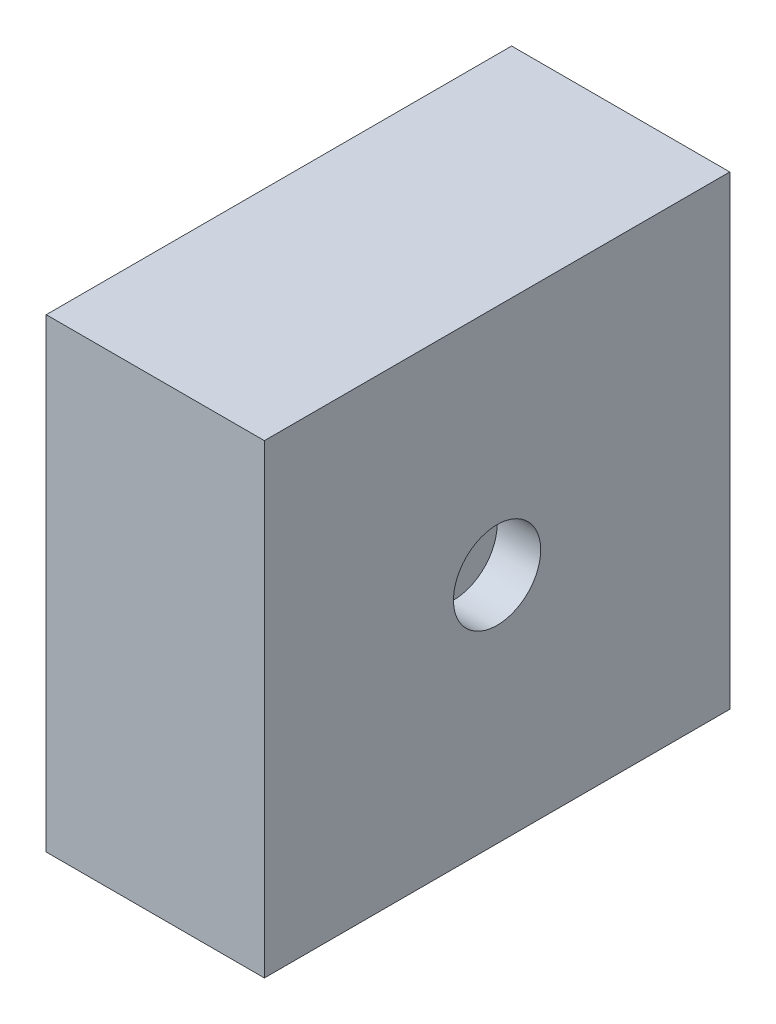
ISO-10303-21;
HEADER;
FILE_DESCRIPTION(('STEP AP214'),'2;1');
FILE_NAME('part.step','',(''),(''),'','','');
FILE_SCHEMA(('AUTOMOTIVE_DESIGN { 1 0 10303 214 1 1 1 1 }'));
ENDSEC;
DATA;
#1=APPLICATION_CONTEXT('core data for automotive mechanical design processes');
#2=APPLICATION_PROTOCOL_DEFINITION('international standard','automotive_design',2000,#1);
#3=PRODUCT_CONTEXT('',#1,'mechanical');
#4=PRODUCT('Part','Part','',(#3));
#5=PRODUCT_RELATED_PRODUCT_CATEGORY('part','',(#4));
#6=PRODUCT_DEFINITION_FORMATION('','',#4);
#7=PRODUCT_DEFINITION_CONTEXT('part definition',#1,'design');
#8=PRODUCT_DEFINITION('design','',#6,#7);
#9=PRODUCT_DEFINITION_SHAPE('','',#8);
#10=(LENGTH_UNIT() NAMED_UNIT(*) SI_UNIT(.MILLI.,.METRE.));
#11=(NAMED_UNIT(*) PLANE_ANGLE_UNIT() SI_UNIT($,.RADIAN.));
#12=(NAMED_UNIT(*) SI_UNIT($,.STERADIAN.) SOLID_ANGLE_UNIT());
#13=UNCERTAINTY_MEASURE_WITH_UNIT(LENGTH_MEASURE(1.E-05),#10,'distance_accuracy_value','');
#14=(GEOMETRIC_REPRESENTATION_CONTEXT(3) GLOBAL_UNCERTAINTY_ASSIGNED_CONTEXT((#13)) GLOBAL_UNIT_ASSIGNED_CONTEXT((#10,
#11,#12)) REPRESENTATION_CONTEXT('',''));
#15=CARTESIAN_POINT('',(0.,0.,0.));
#16=DIRECTION('',(0.,0.,1.));
#17=DIRECTION('',(1.,0.,0.));
#18=AXIS2_PLACEMENT_3D('',#15,#16,#17);
#19=CARTESIAN_POINT('',(15.,0.,0.));
#20=DIRECTION('',(0.,0.,1.));
#21=DIRECTION('',(0.,-1.,0.));
#22=AXIS2_PLACEMENT_3D('',#19,#20,#21);
#23=PLANE('',#22);
#24=DIRECTION('',(0.,1.,0.));
#25=VECTOR('',#24,1.);
#26=CARTESIAN_POINT('',(0.,0.,0.));
#27=LINE('',#26,#25);
#28=CARTESIAN_POINT('',(0.,-32.,0.));
#29=VERTEX_POINT('',#28);
#30=CARTESIAN_POINT('',(0.,0.,0.));
#31=VERTEX_POINT('',#30);
#32=EDGE_CURVE('E107',#29,#31,#27,.T.);
#33=ORIENTED_EDGE('',*,*,#32,.T.);
#34=DIRECTION('',(-1.,0.,0.));
#35=VECTOR('',#34,1.);
#36=CARTESIAN_POINT('',(15.,0.,0.));
#37=LINE('',#36,#35);
#38=CARTESIAN_POINT('',(15.,0.,0.));
#39=VERTEX_POINT('',#38);
#40=EDGE_CURVE('E11',#39,#31,#37,.T.);
#41=ORIENTED_EDGE('',*,*,#40,.F.);
#42=DIRECTION('',(0.,1.,0.));
#43=VECTOR('',#42,1.);
#44=CARTESIAN_POINT('',(15.,0.,0.));
#45=LINE('',#44,#43);
#46=CARTESIAN_POINT('',(15.,-32.,0.));
#47=VERTEX_POINT('',#46);
#48=EDGE_CURVE('E91',#47,#39,#45,.T.);
#49=ORIENTED_EDGE('',*,*,#48,.F.);
#50=DIRECTION('',(-1.,0.,0.));
#51=VECTOR('',#50,1.);
#52=CARTESIAN_POINT('',(15.,-32.,0.));
#53=LINE('',#52,#51);
#54=EDGE_CURVE('E103',#47,#29,#53,.T.);
#55=ORIENTED_EDGE('',*,*,#54,.T.);
#56=EDGE_LOOP('',(#33,#41,#49,#55));
#57=FACE_BOUND('',#56,.T.);
#58=ADVANCED_FACE('F39',(#57),#23,.F.);
#59=CARTESIAN_POINT('',(15.,0.,0.));
#60=DIRECTION('',(0.,-1.,0.));
#61=DIRECTION('',(0.,0.,-1.));
#62=AXIS2_PLACEMENT_3D('',#59,#60,#61);
#63=PLANE('',#62);
#64=DIRECTION('',(0.,0.,1.));
#65=VECTOR('',#64,1.);
#66=CARTESIAN_POINT('',(0.,0.,0.));
#67=LINE('',#66,#65);
#68=CARTESIAN_POINT('',(0.,0.,32.));
#69=VERTEX_POINT('',#68);
#70=EDGE_CURVE('E96',#31,#69,#67,.T.);
#71=ORIENTED_EDGE('',*,*,#70,.T.);
#72=DIRECTION('',(-1.,0.,0.));
#73=VECTOR('',#72,1.);
#74=CARTESIAN_POINT('',(15.,0.,32.));
#75=LINE('',#74,#73);
#76=CARTESIAN_POINT('',(15.,0.,32.));
#77=VERTEX_POINT('',#76);
#78=EDGE_CURVE('E48',#77,#69,#75,.T.);
#79=ORIENTED_EDGE('',*,*,#78,.F.);
#80=DIRECTION('',(0.,0.,1.));
#81=VECTOR('',#80,1.);
#82=CARTESIAN_POINT('',(15.,0.,0.));
#83=LINE('',#82,#81);
#84=EDGE_CURVE('E86',#39,#77,#83,.T.);
#85=ORIENTED_EDGE('',*,*,#84,.F.);
#86=ORIENTED_EDGE('',*,*,#40,.T.);
#87=EDGE_LOOP('',(#71,#79,#85,#86));
#88=FACE_BOUND('',#87,.T.);
#89=ADVANCED_FACE('F95',(#88),#63,.F.);
#90=CARTESIAN_POINT('',(15.,0.,32.));
#91=DIRECTION('',(0.,0.,-1.));
#92=DIRECTION('',(0.,1.,0.));
#93=AXIS2_PLACEMENT_3D('',#90,#91,#92);
#94=PLANE('',#93);
#95=DIRECTION('',(0.,-1.,0.));
#96=VECTOR('',#95,1.);
#97=CARTESIAN_POINT('',(0.,0.,32.));
#98=LINE('',#97,#96);
#99=CARTESIAN_POINT('',(0.,-32.,32.));
#100=VERTEX_POINT('',#99);
#101=EDGE_CURVE('E73',#69,#100,#98,.T.);
#102=ORIENTED_EDGE('',*,*,#101,.T.);
#103=DIRECTION('',(-1.,0.,0.));
#104=VECTOR('',#103,1.);
#105=CARTESIAN_POINT('',(15.,-32.,32.));
#106=LINE('',#105,#104);
#107=CARTESIAN_POINT('',(15.,-32.,32.));
#108=VERTEX_POINT('',#107);
#109=EDGE_CURVE('E98',#108,#100,#106,.T.);
#110=ORIENTED_EDGE('',*,*,#109,.F.);
#111=DIRECTION('',(0.,-1.,0.));
#112=VECTOR('',#111,1.);
#113=CARTESIAN_POINT('',(15.,0.,32.));
#114=LINE('',#113,#112);
#115=EDGE_CURVE('E89',#77,#108,#114,.T.);
#116=ORIENTED_EDGE('',*,*,#115,.F.);
#117=ORIENTED_EDGE('',*,*,#78,.T.);
#118=EDGE_LOOP('',(#102,#110,#116,#117));
#119=FACE_BOUND('',#118,.T.);
#120=ADVANCED_FACE('F99',(#119),#94,.F.);
#121=CARTESIAN_POINT('',(15.,-32.,0.));
#122=DIRECTION('',(0.,1.,0.));
#123=DIRECTION('',(0.,0.,1.));
#124=AXIS2_PLACEMENT_3D('',#121,#122,#123);
#125=PLANE('',#124);
#126=DIRECTION('',(0.,0.,-1.));
#127=VECTOR('',#126,1.);
#128=CARTESIAN_POINT('',(0.,-32.,0.));
#129=LINE('',#128,#127);
#130=EDGE_CURVE('E79',#100,#29,#129,.T.);
#131=ORIENTED_EDGE('',*,*,#130,.T.);
#132=ORIENTED_EDGE('',*,*,#54,.F.);
#133=DIRECTION('',(0.,0.,-1.));
#134=VECTOR('',#133,1.);
#135=CARTESIAN_POINT('',(15.,-32.,0.));
#136=LINE('',#135,#134);
#137=EDGE_CURVE('E56',#108,#47,#136,.T.);
#138=ORIENTED_EDGE('',*,*,#137,.F.);
#139=ORIENTED_EDGE('',*,*,#109,.T.);
#140=EDGE_LOOP('',(#131,#132,#138,#139));
#141=FACE_BOUND('',#140,.T.);
#142=ADVANCED_FACE('F121',(#141),#125,.F.);
#143=CARTESIAN_POINT('',(15.,0.,0.));
#144=DIRECTION('',(-1.,0.,0.));
#145=DIRECTION('',(0.,0.,1.));
#146=AXIS2_PLACEMENT_3D('',#143,#144,#145);
#147=PLANE('',#146);
#148=CARTESIAN_POINT('',(15.,-16.,16.));
#149=DIRECTION('',(1.,0.,0.));
#150=DIRECTION('',(0.,0.,-1.));
#151=AXIS2_PLACEMENT_3D('',#148,#149,#150);
#152=CIRCLE('',#151,3.);
#153=CARTESIAN_POINT('',(15.,-16.,13.));
#154=VERTEX_POINT('',#153);
#155=EDGE_CURVE('E128',#154,#154,#152,.T.);
#156=ORIENTED_EDGE('',*,*,#155,.F.);
#157=EDGE_LOOP('',(#156));
#158=FACE_BOUND('',#157,.T.);
#159=ORIENTED_EDGE('',*,*,#48,.T.);
#160=ORIENTED_EDGE('',*,*,#84,.T.);
#161=ORIENTED_EDGE('',*,*,#115,.T.);
#162=ORIENTED_EDGE('',*,*,#137,.T.);
#163=EDGE_LOOP('',(#159,#160,#161,#162));
#164=FACE_BOUND('',#163,.T.);
#165=ADVANCED_FACE('F87',(#158,#164),#147,.F.);
#166=CARTESIAN_POINT('',(0.,0.,0.));
#167=DIRECTION('',(-1.,0.,0.));
#168=DIRECTION('',(0.,0.,1.));
#169=AXIS2_PLACEMENT_3D('',#166,#167,#168);
#170=PLANE('',#169);
#171=ORIENTED_EDGE('',*,*,#32,.F.);
#172=ORIENTED_EDGE('',*,*,#130,.F.);
#173=ORIENTED_EDGE('',*,*,#101,.F.);
#174=ORIENTED_EDGE('',*,*,#70,.F.);
#175=EDGE_LOOP('',(#171,#172,#173,#174));
#176=FACE_BOUND('',#175,.T.);
#177=ADVANCED_FACE('F124',(#176),#170,.T.);
#178=CARTESIAN_POINT('',(12.,-16.,16.));
#179=DIRECTION('',(1.,0.,0.));
#180=DIRECTION('',(0.,0.,-1.));
#181=AXIS2_PLACEMENT_3D('',#178,#179,#180);
#182=CYLINDRICAL_SURFACE('',#181,3.);
#183=CARTESIAN_POINT('',(12.,-16.,16.));
#184=DIRECTION('',(1.,0.,0.));
#185=DIRECTION('',(0.,0.,-1.));
#186=AXIS2_PLACEMENT_3D('',#183,#184,#185);
#187=CIRCLE('',#186,3.);
#188=CARTESIAN_POINT('',(12.,-16.,13.));
#189=VERTEX_POINT('',#188);
#190=EDGE_CURVE('E111',#189,#189,#187,.T.);
#191=ORIENTED_EDGE('',*,*,#190,.F.);
#192=EDGE_LOOP('',(#191));
#193=FACE_BOUND('',#192,.T.);
#194=ORIENTED_EDGE('',*,*,#155,.T.);
#195=EDGE_LOOP('',(#194));
#196=FACE_BOUND('',#195,.T.);
#197=ADVANCED_FACE('F138',(#193,#196),#182,.F.);
#198=CARTESIAN_POINT('',(12.,-16.,16.));
#199=DIRECTION('',(1.,0.,0.));
#200=DIRECTION('',(0.,0.,-1.));
#201=AXIS2_PLACEMENT_3D('',#198,#199,#200);
#202=PLANE('',#201);
#203=ORIENTED_EDGE('',*,*,#190,.T.);
#204=EDGE_LOOP('',(#203));
#205=FACE_BOUND('',#204,.T.);
#206=ADVANCED_FACE('F136',(#205),#202,.T.);
#207=CLOSED_SHELL('',(#58,#89,#120,#142,#165,#177,#197,#206));
#208=MANIFOLD_SOLID_BREP('B2',#207);
#209=ADVANCED_BREP_SHAPE_REPRESENTATION('',(#18,#208),#14);
#210=SHAPE_DEFINITION_REPRESENTATION(#9,#209);
ENDSEC;
END-ISO-10303-21;
